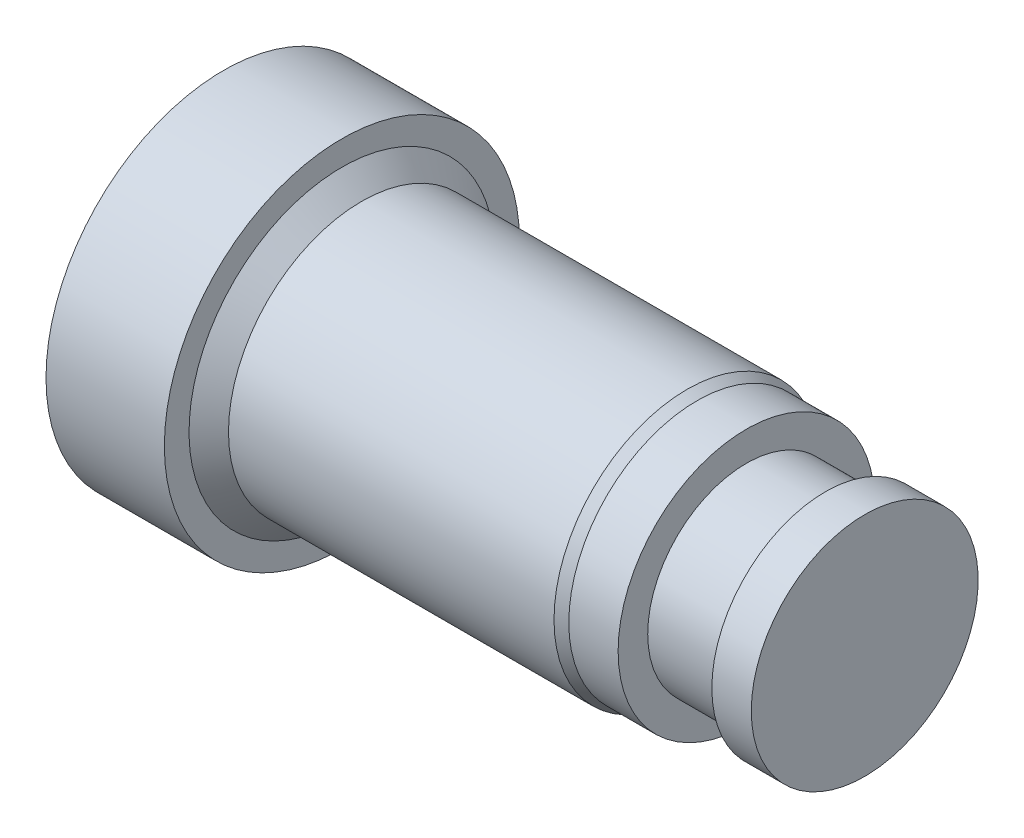
ISO-10303-21;
HEADER;
FILE_DESCRIPTION(('STEP AP214'),'2;1');
FILE_NAME('part.step','',(''),(''),'','','');
FILE_SCHEMA(('AUTOMOTIVE_DESIGN { 1 0 10303 214 1 1 1 1 }'));
ENDSEC;
DATA;
#1=APPLICATION_CONTEXT('core data for automotive mechanical design processes');
#2=APPLICATION_PROTOCOL_DEFINITION('international standard','automotive_design',2000,#1);
#3=PRODUCT_CONTEXT('',#1,'mechanical');
#4=PRODUCT('Part','Part','',(#3));
#5=PRODUCT_RELATED_PRODUCT_CATEGORY('part','',(#4));
#6=PRODUCT_DEFINITION_FORMATION('','',#4);
#7=PRODUCT_DEFINITION_CONTEXT('part definition',#1,'design');
#8=PRODUCT_DEFINITION('design','',#6,#7);
#9=PRODUCT_DEFINITION_SHAPE('','',#8);
#10=(LENGTH_UNIT() NAMED_UNIT(*) SI_UNIT(.MILLI.,.METRE.));
#11=(NAMED_UNIT(*) PLANE_ANGLE_UNIT() SI_UNIT($,.RADIAN.));
#12=(NAMED_UNIT(*) SI_UNIT($,.STERADIAN.) SOLID_ANGLE_UNIT());
#13=UNCERTAINTY_MEASURE_WITH_UNIT(LENGTH_MEASURE(1.E-05),#10,'distance_accuracy_value','');
#14=(GEOMETRIC_REPRESENTATION_CONTEXT(3) GLOBAL_UNCERTAINTY_ASSIGNED_CONTEXT((#13)) GLOBAL_UNIT_ASSIGNED_CONTEXT((#10,
#11,#12)) REPRESENTATION_CONTEXT('',''));
#15=CARTESIAN_POINT('',(0.,0.,0.));
#16=DIRECTION('',(0.,0.,1.));
#17=DIRECTION('',(1.,0.,0.));
#18=AXIS2_PLACEMENT_3D('',#15,#16,#17);
#19=CARTESIAN_POINT('',(325.,57.5,0.));
#20=DIRECTION('',(-1.,0.,0.));
#21=DIRECTION('',(0.,0.,1.));
#22=AXIS2_PLACEMENT_3D('',#19,#20,#21);
#23=PLANE('',#22);
#24=CARTESIAN_POINT('',(325.,0.,0.));
#25=DIRECTION('',(-1.,0.,0.));
#26=DIRECTION('',(0.,0.,1.));
#27=AXIS2_PLACEMENT_3D('',#24,#25,#26);
#28=CIRCLE('',#27,57.5);
#29=CARTESIAN_POINT('',(325.,0.,57.5));
#30=VERTEX_POINT('',#29);
#31=EDGE_CURVE('E20',#30,#30,#28,.T.);
#32=ORIENTED_EDGE('',*,*,#31,.F.);
#33=EDGE_LOOP('',(#32));
#34=FACE_BOUND('',#33,.T.);
#35=ADVANCED_FACE('F17',(#34),#23,.F.);
#36=CARTESIAN_POINT('',(0.,0.,0.));
#37=DIRECTION('',(-1.,0.,0.));
#38=DIRECTION('',(0.,0.,1.));
#39=AXIS2_PLACEMENT_3D('',#36,#37,#38);
#40=CYLINDRICAL_SURFACE('',#39,57.5);
#41=CARTESIAN_POINT('',(305.,0.,0.));
#42=DIRECTION('',(-1.,0.,0.));
#43=DIRECTION('',(0.,0.,1.));
#44=AXIS2_PLACEMENT_3D('',#41,#42,#43);
#45=CIRCLE('',#44,57.5);
#46=CARTESIAN_POINT('',(305.,0.,57.5));
#47=VERTEX_POINT('',#46);
#48=EDGE_CURVE('E56',#47,#47,#45,.F.);
#49=ORIENTED_EDGE('',*,*,#48,.T.);
#50=EDGE_LOOP('',(#49));
#51=FACE_BOUND('',#50,.T.);
#52=ORIENTED_EDGE('',*,*,#31,.T.);
#53=EDGE_LOOP('',(#52));
#54=FACE_BOUND('',#53,.T.);
#55=ADVANCED_FACE('F49',(#51,#54),#40,.T.);
#56=CARTESIAN_POINT('',(29.9999999999727,37.4999999999999,-64.951905283833));
#57=DIRECTION('',(-1.,0.,0.));
#58=DIRECTION('',(0.,0.,1.));
#59=AXIS2_PLACEMENT_3D('',#56,#57,#58);
#60=CONICAL_SURFACE('',#59,4.24999999998343,1.02974425867142);
#61=CARTESIAN_POINT('',(32.5536576308423,37.4999999999999,-64.951905283833));
#62=VERTEX_POINT('',#61);
#63=VERTEX_LOOP('',#62);
#64=FACE_BOUND('',#63,.T.);
#65=CARTESIAN_POINT('',(30.,37.4999999999999,-64.951905283833));
#66=DIRECTION('',(-1.,0.,0.));
#67=DIRECTION('',(0.,0.,1.));
#68=AXIS2_PLACEMENT_3D('',#65,#66,#67);
#69=CIRCLE('',#68,4.24999999999999);
#70=CARTESIAN_POINT('',(30.,37.4999999999999,-60.701905283833));
#71=VERTEX_POINT('',#70);
#72=EDGE_CURVE('E53',#71,#71,#69,.T.);
#73=ORIENTED_EDGE('',*,*,#72,.T.);
#74=EDGE_LOOP('',(#73));
#75=FACE_BOUND('',#74,.T.);
#76=ADVANCED_FACE('F45',(#64,#75),#60,.F.);
#77=CARTESIAN_POINT('',(30.0000000000296,75.,0.));
#78=DIRECTION('',(-1.,0.,0.));
#79=DIRECTION('',(0.,-1.,0.));
#80=AXIS2_PLACEMENT_3D('',#77,#78,#79);
#81=CONICAL_SURFACE('',#80,4.25000000001319,1.0297442586776);
#82=CARTESIAN_POINT('',(32.5536576308991,75.,0.));
#83=VERTEX_POINT('',#82);
#84=VERTEX_LOOP('',#83);
#85=FACE_BOUND('',#84,.T.);
#86=CARTESIAN_POINT('',(30.,75.,0.));
#87=DIRECTION('',(-1.,0.,0.));
#88=DIRECTION('',(0.,0.,1.));
#89=AXIS2_PLACEMENT_3D('',#86,#87,#88);
#90=CIRCLE('',#89,4.24999999999999);
#91=CARTESIAN_POINT('',(30.,75.,4.24999999999999));
#92=VERTEX_POINT('',#91);
#93=EDGE_CURVE('E55',#92,#92,#90,.T.);
#94=ORIENTED_EDGE('',*,*,#93,.T.);
#95=EDGE_LOOP('',(#94));
#96=FACE_BOUND('',#95,.T.);
#97=ADVANCED_FACE('F48',(#85,#96),#81,.F.);
#98=CARTESIAN_POINT('',(29.9999999999727,37.5000000000008,64.9519052838325));
#99=DIRECTION('',(-1.,0.,0.));
#100=DIRECTION('',(0.,0.,1.));
#101=AXIS2_PLACEMENT_3D('',#98,#99,#100);
#102=CONICAL_SURFACE('',#101,4.24999999998661,1.02974425868191);
#103=CARTESIAN_POINT('',(32.5536576307854,37.5000000000008,64.9519052838325));
#104=VERTEX_POINT('',#103);
#105=VERTEX_LOOP('',#104);
#106=FACE_BOUND('',#105,.T.);
#107=CARTESIAN_POINT('',(30.,37.5000000000008,64.9519052838325));
#108=DIRECTION('',(-1.,0.,0.));
#109=DIRECTION('',(0.,0.,1.));
#110=AXIS2_PLACEMENT_3D('',#107,#108,#109);
#111=CIRCLE('',#110,4.24999999999999);
#112=CARTESIAN_POINT('',(30.,37.5000000000008,69.2019052838325));
#113=VERTEX_POINT('',#112);
#114=EDGE_CURVE('E59',#113,#113,#111,.T.);
#115=ORIENTED_EDGE('',*,*,#114,.T.);
#116=EDGE_LOOP('',(#115));
#117=FACE_BOUND('',#116,.T.);
#118=ADVANCED_FACE('F123',(#106,#117),#102,.F.);
#119=CARTESIAN_POINT('',(29.9999999999727,-37.4999999999999,64.951905283833));
#120=DIRECTION('',(-1.,0.,0.));
#121=DIRECTION('',(0.,0.,1.));
#122=AXIS2_PLACEMENT_3D('',#119,#120,#121);
#123=CONICAL_SURFACE('',#122,4.2499999999861,1.0297442586818);
#124=CARTESIAN_POINT('',(32.5536576307854,-37.4999999999999,64.951905283833));
#125=VERTEX_POINT('',#124);
#126=VERTEX_LOOP('',#125);
#127=FACE_BOUND('',#126,.T.);
#128=CARTESIAN_POINT('',(30.,-37.4999999999999,64.951905283833));
#129=DIRECTION('',(-1.,0.,0.));
#130=DIRECTION('',(0.,0.,1.));
#131=AXIS2_PLACEMENT_3D('',#128,#129,#130);
#132=CIRCLE('',#131,4.24999999999999);
#133=CARTESIAN_POINT('',(30.,-37.4999999999999,69.201905283833));
#134=VERTEX_POINT('',#133);
#135=EDGE_CURVE('E115',#134,#134,#132,.T.);
#136=ORIENTED_EDGE('',*,*,#135,.T.);
#137=EDGE_LOOP('',(#136));
#138=FACE_BOUND('',#137,.T.);
#139=ADVANCED_FACE('F214',(#127,#138),#123,.F.);
#140=CARTESIAN_POINT('',(30.0000000000296,-75.,0.));
#141=DIRECTION('',(-1.,0.,0.));
#142=DIRECTION('',(0.,-1.,0.));
#143=AXIS2_PLACEMENT_3D('',#140,#141,#142);
#144=CONICAL_SURFACE('',#143,4.25000000001319,1.0297442586776);
#145=CARTESIAN_POINT('',(32.5536576308991,-75.,0.));
#146=VERTEX_POINT('',#145);
#147=VERTEX_LOOP('',#146);
#148=FACE_BOUND('',#147,.T.);
#149=CARTESIAN_POINT('',(30.,-75.,0.));
#150=DIRECTION('',(-1.,0.,0.));
#151=DIRECTION('',(0.,0.,1.));
#152=AXIS2_PLACEMENT_3D('',#149,#150,#151);
#153=CIRCLE('',#152,4.24999999999999);
#154=CARTESIAN_POINT('',(30.,-75.,4.24999999999999));
#155=VERTEX_POINT('',#154);
#156=EDGE_CURVE('E110',#155,#155,#153,.T.);
#157=ORIENTED_EDGE('',*,*,#156,.T.);
#158=EDGE_LOOP('',(#157));
#159=FACE_BOUND('',#158,.T.);
#160=ADVANCED_FACE('F216',(#148,#159),#144,.F.);
#161=CARTESIAN_POINT('',(29.9999999999727,-37.5000000000008,-64.9519052838325));
#162=DIRECTION('',(-1.,0.,0.));
#163=DIRECTION('',(0.,0.,1.));
#164=AXIS2_PLACEMENT_3D('',#161,#162,#163);
#165=CONICAL_SURFACE('',#164,4.25000000003976,1.02974425866739);
#166=CARTESIAN_POINT('',(32.5536576308991,-37.5000000000008,-64.9519052838325));
#167=VERTEX_POINT('',#166);
#168=VERTEX_LOOP('',#167);
#169=FACE_BOUND('',#168,.T.);
#170=CARTESIAN_POINT('',(30.,-37.5000000000008,-64.9519052838325));
#171=DIRECTION('',(-1.,0.,0.));
#172=DIRECTION('',(0.,0.,1.));
#173=AXIS2_PLACEMENT_3D('',#170,#171,#172);
#174=CIRCLE('',#173,4.24999999999999);
#175=CARTESIAN_POINT('',(30.,-37.5000000000008,-60.7019052838325));
#176=VERTEX_POINT('',#175);
#177=EDGE_CURVE('E106',#176,#176,#174,.T.);
#178=ORIENTED_EDGE('',*,*,#177,.T.);
#179=EDGE_LOOP('',(#178));
#180=FACE_BOUND('',#179,.T.);
#181=ADVANCED_FACE('F223',(#169,#180),#165,.F.);
#182=CARTESIAN_POINT('',(20.,0.,0.));
#183=DIRECTION('',(-1.,0.,0.));
#184=DIRECTION('',(0.,0.,1.));
#185=AXIS2_PLACEMENT_3D('',#182,#183,#184);
#186=PLANE('',#185);
#187=CARTESIAN_POINT('',(20.,0.,0.));
#188=DIRECTION('',(-1.,0.,0.));
#189=DIRECTION('',(0.,0.,1.));
#190=AXIS2_PLACEMENT_3D('',#187,#188,#189);
#191=CIRCLE('',#190,57.5);
#192=CARTESIAN_POINT('',(20.,0.,57.5));
#193=VERTEX_POINT('',#192);
#194=EDGE_CURVE('E104',#193,#193,#191,.T.);
#195=ORIENTED_EDGE('',*,*,#194,.T.);
#196=EDGE_LOOP('',(#195));
#197=FACE_BOUND('',#196,.T.);
#198=ADVANCED_FACE('F155',(#197),#186,.T.);
#199=CARTESIAN_POINT('',(305.,50.,0.));
#200=DIRECTION('',(1.,0.,0.));
#201=DIRECTION('',(0.,0.,-1.));
#202=AXIS2_PLACEMENT_3D('',#199,#200,#201);
#203=PLANE('',#202);
#204=ORIENTED_EDGE('',*,*,#48,.F.);
#205=EDGE_LOOP('',(#204));
#206=FACE_BOUND('',#205,.T.);
#207=CARTESIAN_POINT('',(305.,0.,0.));
#208=DIRECTION('',(-1.,0.,0.));
#209=DIRECTION('',(0.,0.,1.));
#210=AXIS2_PLACEMENT_3D('',#207,#208,#209);
#211=CIRCLE('',#210,50.);
#212=CARTESIAN_POINT('',(305.,0.,50.));
#213=VERTEX_POINT('',#212);
#214=EDGE_CURVE('E101',#213,#213,#211,.T.);
#215=ORIENTED_EDGE('',*,*,#214,.F.);
#216=EDGE_LOOP('',(#215));
#217=FACE_BOUND('',#216,.T.);
#218=ADVANCED_FACE('F146',(#206,#217),#203,.F.);
#219=CARTESIAN_POINT('',(0.,37.4999999999999,-64.951905283833));
#220=DIRECTION('',(-1.,0.,0.));
#221=DIRECTION('',(0.,0.,1.));
#222=AXIS2_PLACEMENT_3D('',#219,#220,#221);
#223=CYLINDRICAL_SURFACE('',#222,4.24999999999999);
#224=ORIENTED_EDGE('',*,*,#72,.F.);
#225=EDGE_LOOP('',(#224));
#226=FACE_BOUND('',#225,.T.);
#227=CARTESIAN_POINT('',(0.,37.4999999999999,-64.951905283833));
#228=DIRECTION('',(-1.,0.,0.));
#229=DIRECTION('',(0.,0.,1.));
#230=AXIS2_PLACEMENT_3D('',#227,#228,#229);
#231=CIRCLE('',#230,4.24999999999999);
#232=CARTESIAN_POINT('',(0.,37.4999999999999,-60.701905283833));
#233=VERTEX_POINT('',#232);
#234=EDGE_CURVE('E98',#233,#233,#231,.T.);
#235=ORIENTED_EDGE('',*,*,#234,.T.);
#236=EDGE_LOOP('',(#235));
#237=FACE_BOUND('',#236,.T.);
#238=ADVANCED_FACE('F144',(#226,#237),#223,.F.);
#239=CARTESIAN_POINT('',(0.,75.,0.));
#240=DIRECTION('',(-1.,0.,0.));
#241=DIRECTION('',(0.,0.,1.));
#242=AXIS2_PLACEMENT_3D('',#239,#240,#241);
#243=CYLINDRICAL_SURFACE('',#242,4.24999999999999);
#244=ORIENTED_EDGE('',*,*,#93,.F.);
#245=EDGE_LOOP('',(#244));
#246=FACE_BOUND('',#245,.T.);
#247=CARTESIAN_POINT('',(0.,75.,0.));
#248=DIRECTION('',(-1.,0.,0.));
#249=DIRECTION('',(0.,0.,1.));
#250=AXIS2_PLACEMENT_3D('',#247,#248,#249);
#251=CIRCLE('',#250,4.24999999999999);
#252=CARTESIAN_POINT('',(0.,75.,4.24999999999999));
#253=VERTEX_POINT('',#252);
#254=EDGE_CURVE('E95',#253,#253,#251,.T.);
#255=ORIENTED_EDGE('',*,*,#254,.T.);
#256=EDGE_LOOP('',(#255));
#257=FACE_BOUND('',#256,.T.);
#258=ADVANCED_FACE('F129',(#246,#257),#243,.F.);
#259=CARTESIAN_POINT('',(0.,37.5000000000008,64.9519052838325));
#260=DIRECTION('',(-1.,0.,0.));
#261=DIRECTION('',(0.,0.,1.));
#262=AXIS2_PLACEMENT_3D('',#259,#260,#261);
#263=CYLINDRICAL_SURFACE('',#262,4.24999999999999);
#264=ORIENTED_EDGE('',*,*,#114,.F.);
#265=EDGE_LOOP('',(#264));
#266=FACE_BOUND('',#265,.T.);
#267=CARTESIAN_POINT('',(0.,37.5000000000008,64.9519052838325));
#268=DIRECTION('',(-1.,0.,0.));
#269=DIRECTION('',(0.,0.,1.));
#270=AXIS2_PLACEMENT_3D('',#267,#268,#269);
#271=CIRCLE('',#270,4.24999999999999);
#272=CARTESIAN_POINT('',(0.,37.5000000000008,69.2019052838325));
#273=VERTEX_POINT('',#272);
#274=EDGE_CURVE('E92',#273,#273,#271,.T.);
#275=ORIENTED_EDGE('',*,*,#274,.T.);
#276=EDGE_LOOP('',(#275));
#277=FACE_BOUND('',#276,.T.);
#278=ADVANCED_FACE('F125',(#266,#277),#263,.F.);
#279=CARTESIAN_POINT('',(0.,-37.4999999999999,64.951905283833));
#280=DIRECTION('',(-1.,0.,0.));
#281=DIRECTION('',(0.,0.,1.));
#282=AXIS2_PLACEMENT_3D('',#279,#280,#281);
#283=CYLINDRICAL_SURFACE('',#282,4.24999999999999);
#284=ORIENTED_EDGE('',*,*,#135,.F.);
#285=EDGE_LOOP('',(#284));
#286=FACE_BOUND('',#285,.T.);
#287=CARTESIAN_POINT('',(0.,-37.4999999999999,64.951905283833));
#288=DIRECTION('',(-1.,0.,0.));
#289=DIRECTION('',(0.,0.,1.));
#290=AXIS2_PLACEMENT_3D('',#287,#288,#289);
#291=CIRCLE('',#290,4.24999999999999);
#292=CARTESIAN_POINT('',(0.,-37.4999999999999,69.201905283833));
#293=VERTEX_POINT('',#292);
#294=EDGE_CURVE('E89',#293,#293,#291,.T.);
#295=ORIENTED_EDGE('',*,*,#294,.T.);
#296=EDGE_LOOP('',(#295));
#297=FACE_BOUND('',#296,.T.);
#298=ADVANCED_FACE('F128',(#286,#297),#283,.F.);
#299=CARTESIAN_POINT('',(0.,-75.,0.));
#300=DIRECTION('',(-1.,0.,0.));
#301=DIRECTION('',(0.,0.,1.));
#302=AXIS2_PLACEMENT_3D('',#299,#300,#301);
#303=CYLINDRICAL_SURFACE('',#302,4.24999999999999);
#304=ORIENTED_EDGE('',*,*,#156,.F.);
#305=EDGE_LOOP('',(#304));
#306=FACE_BOUND('',#305,.T.);
#307=CARTESIAN_POINT('',(0.,-75.,0.));
#308=DIRECTION('',(-1.,0.,0.));
#309=DIRECTION('',(0.,0.,1.));
#310=AXIS2_PLACEMENT_3D('',#307,#308,#309);
#311=CIRCLE('',#310,4.24999999999999);
#312=CARTESIAN_POINT('',(0.,-75.,4.24999999999999));
#313=VERTEX_POINT('',#312);
#314=EDGE_CURVE('E86',#313,#313,#311,.T.);
#315=ORIENTED_EDGE('',*,*,#314,.T.);
#316=EDGE_LOOP('',(#315));
#317=FACE_BOUND('',#316,.T.);
#318=ADVANCED_FACE('F200',(#306,#317),#303,.F.);
#319=CARTESIAN_POINT('',(0.,-37.5000000000008,-64.9519052838325));
#320=DIRECTION('',(-1.,0.,0.));
#321=DIRECTION('',(0.,0.,1.));
#322=AXIS2_PLACEMENT_3D('',#319,#320,#321);
#323=CYLINDRICAL_SURFACE('',#322,4.24999999999999);
#324=ORIENTED_EDGE('',*,*,#177,.F.);
#325=EDGE_LOOP('',(#324));
#326=FACE_BOUND('',#325,.T.);
#327=CARTESIAN_POINT('',(0.,-37.5000000000008,-64.9519052838325));
#328=DIRECTION('',(-1.,0.,0.));
#329=DIRECTION('',(0.,0.,1.));
#330=AXIS2_PLACEMENT_3D('',#327,#328,#329);
#331=CIRCLE('',#330,4.24999999999999);
#332=CARTESIAN_POINT('',(0.,-37.5000000000008,-60.7019052838325));
#333=VERTEX_POINT('',#332);
#334=EDGE_CURVE('E83',#333,#333,#331,.T.);
#335=ORIENTED_EDGE('',*,*,#334,.T.);
#336=EDGE_LOOP('',(#335));
#337=FACE_BOUND('',#336,.T.);
#338=ADVANCED_FACE('F196',(#326,#337),#323,.F.);
#339=CARTESIAN_POINT('',(20.,0.,0.));
#340=DIRECTION('',(-1.,0.,0.));
#341=DIRECTION('',(0.,0.,1.));
#342=AXIS2_PLACEMENT_3D('',#339,#340,#341);
#343=CYLINDRICAL_SURFACE('',#342,57.5);
#344=ORIENTED_EDGE('',*,*,#194,.F.);
#345=EDGE_LOOP('',(#344));
#346=FACE_BOUND('',#345,.T.);
#347=CARTESIAN_POINT('',(0.,0.,0.));
#348=DIRECTION('',(-1.,0.,0.));
#349=DIRECTION('',(0.,0.,1.));
#350=AXIS2_PLACEMENT_3D('',#347,#348,#349);
#351=CIRCLE('',#350,57.5);
#352=CARTESIAN_POINT('',(0.,0.,57.5));
#353=VERTEX_POINT('',#352);
#354=EDGE_CURVE('E80',#353,#353,#351,.T.);
#355=ORIENTED_EDGE('',*,*,#354,.T.);
#356=EDGE_LOOP('',(#355));
#357=FACE_BOUND('',#356,.T.);
#358=ADVANCED_FACE('F192',(#346,#357),#343,.F.);
#359=CARTESIAN_POINT('',(0.,0.,0.));
#360=DIRECTION('',(-1.,0.,0.));
#361=DIRECTION('',(0.,0.,1.));
#362=AXIS2_PLACEMENT_3D('',#359,#360,#361);
#363=CYLINDRICAL_SURFACE('',#362,50.);
#364=CARTESIAN_POINT('',(265.,0.,0.));
#365=DIRECTION('',(-1.,0.,0.));
#366=DIRECTION('',(0.,0.,1.));
#367=AXIS2_PLACEMENT_3D('',#364,#365,#366);
#368=CIRCLE('',#367,50.);
#369=CARTESIAN_POINT('',(265.,0.,50.));
#370=VERTEX_POINT('',#369);
#371=EDGE_CURVE('E77',#370,#370,#368,.F.);
#372=ORIENTED_EDGE('',*,*,#371,.T.);
#373=EDGE_LOOP('',(#372));
#374=FACE_BOUND('',#373,.T.);
#375=ORIENTED_EDGE('',*,*,#214,.T.);
#376=EDGE_LOOP('',(#375));
#377=FACE_BOUND('',#376,.T.);
#378=ADVANCED_FACE('F137',(#374,#377),#363,.T.);
#379=CARTESIAN_POINT('',(0.,0.,0.));
#380=DIRECTION('',(1.,0.,0.));
#381=DIRECTION('',(0.,0.,-1.));
#382=AXIS2_PLACEMENT_3D('',#379,#380,#381);
#383=PLANE('',#382);
#384=CARTESIAN_POINT('',(0.,0.,0.));
#385=DIRECTION('',(-1.,0.,0.));
#386=DIRECTION('',(0.,0.,1.));
#387=AXIS2_PLACEMENT_3D('',#384,#385,#386);
#388=CIRCLE('',#387,90.);
#389=CARTESIAN_POINT('',(0.,0.,90.));
#390=VERTEX_POINT('',#389);
#391=EDGE_CURVE('E74',#390,#390,#388,.F.);
#392=ORIENTED_EDGE('',*,*,#391,.F.);
#393=EDGE_LOOP('',(#392));
#394=FACE_BOUND('',#393,.T.);
#395=ORIENTED_EDGE('',*,*,#354,.F.);
#396=EDGE_LOOP('',(#395));
#397=FACE_BOUND('',#396,.T.);
#398=ORIENTED_EDGE('',*,*,#334,.F.);
#399=EDGE_LOOP('',(#398));
#400=FACE_BOUND('',#399,.T.);
#401=ORIENTED_EDGE('',*,*,#314,.F.);
#402=EDGE_LOOP('',(#401));
#403=FACE_BOUND('',#402,.T.);
#404=ORIENTED_EDGE('',*,*,#294,.F.);
#405=EDGE_LOOP('',(#404));
#406=FACE_BOUND('',#405,.T.);
#407=ORIENTED_EDGE('',*,*,#274,.F.);
#408=EDGE_LOOP('',(#407));
#409=FACE_BOUND('',#408,.T.);
#410=ORIENTED_EDGE('',*,*,#254,.F.);
#411=EDGE_LOOP('',(#410));
#412=FACE_BOUND('',#411,.T.);
#413=ORIENTED_EDGE('',*,*,#234,.F.);
#414=EDGE_LOOP('',(#413));
#415=FACE_BOUND('',#414,.T.);
#416=ADVANCED_FACE('F133',(#394,#397,#400,#403,#406,#409,#412,#415),#383,.F.);
#417=CARTESIAN_POINT('',(265.,65.,0.));
#418=DIRECTION('',(-1.,0.,0.));
#419=DIRECTION('',(0.,0.,1.));
#420=AXIS2_PLACEMENT_3D('',#417,#418,#419);
#421=PLANE('',#420);
#422=ORIENTED_EDGE('',*,*,#371,.F.);
#423=EDGE_LOOP('',(#422));
#424=FACE_BOUND('',#423,.T.);
#425=CARTESIAN_POINT('',(265.,0.,0.));
#426=DIRECTION('',(-1.,0.,0.));
#427=DIRECTION('',(0.,0.,1.));
#428=AXIS2_PLACEMENT_3D('',#425,#426,#427);
#429=CIRCLE('',#428,65.);
#430=CARTESIAN_POINT('',(265.,0.,65.));
#431=VERTEX_POINT('',#430);
#432=EDGE_CURVE('E71',#431,#431,#429,.T.);
#433=ORIENTED_EDGE('',*,*,#432,.F.);
#434=EDGE_LOOP('',(#433));
#435=FACE_BOUND('',#434,.T.);
#436=ADVANCED_FACE('F136',(#424,#435),#421,.F.);
#437=CARTESIAN_POINT('',(0.,0.,0.));
#438=DIRECTION('',(-1.,0.,0.));
#439=DIRECTION('',(0.,0.,1.));
#440=AXIS2_PLACEMENT_3D('',#437,#438,#439);
#441=CYLINDRICAL_SURFACE('',#440,90.);
#442=ORIENTED_EDGE('',*,*,#391,.T.);
#443=EDGE_LOOP('',(#442));
#444=FACE_BOUND('',#443,.T.);
#445=CARTESIAN_POINT('',(60.,0.,0.));
#446=DIRECTION('',(-1.,0.,0.));
#447=DIRECTION('',(0.,0.,1.));
#448=AXIS2_PLACEMENT_3D('',#445,#446,#447);
#449=CIRCLE('',#448,90.);
#450=CARTESIAN_POINT('',(60.,0.,90.));
#451=VERTEX_POINT('',#450);
#452=EDGE_CURVE('E68',#451,#451,#449,.T.);
#453=ORIENTED_EDGE('',*,*,#452,.T.);
#454=EDGE_LOOP('',(#453));
#455=FACE_BOUND('',#454,.T.);
#456=ADVANCED_FACE('F182',(#444,#455),#441,.T.);
#457=CARTESIAN_POINT('',(0.,0.,0.));
#458=DIRECTION('',(-1.,0.,0.));
#459=DIRECTION('',(0.,0.,1.));
#460=AXIS2_PLACEMENT_3D('',#457,#458,#459);
#461=CYLINDRICAL_SURFACE('',#460,65.);
#462=ORIENTED_EDGE('',*,*,#432,.T.);
#463=EDGE_LOOP('',(#462));
#464=FACE_BOUND('',#463,.T.);
#465=CARTESIAN_POINT('',(240.,0.,0.));
#466=DIRECTION('',(-1.,0.,0.));
#467=DIRECTION('',(0.,0.,1.));
#468=AXIS2_PLACEMENT_3D('',#465,#466,#467);
#469=CIRCLE('',#468,65.);
#470=CARTESIAN_POINT('',(240.,0.,65.));
#471=VERTEX_POINT('',#470);
#472=EDGE_CURVE('E67',#471,#471,#469,.T.);
#473=ORIENTED_EDGE('',*,*,#472,.F.);
#474=EDGE_LOOP('',(#473));
#475=FACE_BOUND('',#474,.T.);
#476=ADVANCED_FACE('F178',(#464,#475),#461,.T.);
#477=CARTESIAN_POINT('',(60.,90.,0.));
#478=DIRECTION('',(-1.,0.,0.));
#479=DIRECTION('',(0.,0.,1.));
#480=AXIS2_PLACEMENT_3D('',#477,#478,#479);
#481=PLANE('',#480);
#482=CARTESIAN_POINT('',(60.,0.,0.));
#483=DIRECTION('',(-1.,0.,0.));
#484=DIRECTION('',(0.,-1.,0.));
#485=AXIS2_PLACEMENT_3D('',#482,#483,#484);
#486=CIRCLE('',#485,77.5);
#487=CARTESIAN_POINT('',(60.,-77.5,0.));
#488=VERTEX_POINT('',#487);
#489=EDGE_CURVE('E64',#488,#488,#486,.F.);
#490=ORIENTED_EDGE('',*,*,#489,.F.);
#491=EDGE_LOOP('',(#490));
#492=FACE_BOUND('',#491,.T.);
#493=ORIENTED_EDGE('',*,*,#452,.F.);
#494=EDGE_LOOP('',(#493));
#495=FACE_BOUND('',#494,.T.);
#496=ADVANCED_FACE('F174',(#492,#495),#481,.F.);
#497=CARTESIAN_POINT('',(235.,0.,0.));
#498=DIRECTION('',(-1.,0.,0.));
#499=DIRECTION('',(0.,0.,1.));
#500=AXIS2_PLACEMENT_3D('',#497,#498,#499);
#501=CONICAL_SURFACE('',#500,67.5,0.463647609000804);
#502=ORIENTED_EDGE('',*,*,#472,.T.);
#503=EDGE_LOOP('',(#502));
#504=FACE_BOUND('',#503,.T.);
#505=CARTESIAN_POINT('',(235.,0.,0.));
#506=DIRECTION('',(-1.,0.,0.));
#507=DIRECTION('',(0.,0.,1.));
#508=AXIS2_PLACEMENT_3D('',#505,#506,#507);
#509=CIRCLE('',#508,67.5);
#510=CARTESIAN_POINT('',(235.,0.,67.5));
#511=VERTEX_POINT('',#510);
#512=EDGE_CURVE('E26',#511,#511,#509,.T.);
#513=ORIENTED_EDGE('',*,*,#512,.F.);
#514=EDGE_LOOP('',(#513));
#515=FACE_BOUND('',#514,.T.);
#516=ADVANCED_FACE('F166',(#504,#515),#501,.T.);
#517=CARTESIAN_POINT('',(60.,0.,0.));
#518=DIRECTION('',(-1.,0.,0.));
#519=DIRECTION('',(0.,-1.,0.));
#520=AXIS2_PLACEMENT_3D('',#517,#518,#519);
#521=CONICAL_SURFACE('',#520,77.5,0.785398163397448);
#522=CARTESIAN_POINT('',(70.,0.,0.));
#523=DIRECTION('',(-1.,0.,0.));
#524=DIRECTION('',(0.,0.,1.));
#525=AXIS2_PLACEMENT_3D('',#522,#523,#524);
#526=CIRCLE('',#525,67.5);
#527=CARTESIAN_POINT('',(70.,0.,67.5));
#528=VERTEX_POINT('',#527);
#529=EDGE_CURVE('E11',#528,#528,#526,.F.);
#530=ORIENTED_EDGE('',*,*,#529,.F.);
#531=EDGE_LOOP('',(#530));
#532=FACE_BOUND('',#531,.T.);
#533=ORIENTED_EDGE('',*,*,#489,.T.);
#534=EDGE_LOOP('',(#533));
#535=FACE_BOUND('',#534,.T.);
#536=ADVANCED_FACE('F160',(#532,#535),#521,.T.);
#537=CARTESIAN_POINT('',(0.,0.,0.));
#538=DIRECTION('',(-1.,0.,0.));
#539=DIRECTION('',(0.,0.,1.));
#540=AXIS2_PLACEMENT_3D('',#537,#538,#539);
#541=CYLINDRICAL_SURFACE('',#540,67.5);
#542=ORIENTED_EDGE('',*,*,#512,.T.);
#543=EDGE_LOOP('',(#542));
#544=FACE_BOUND('',#543,.T.);
#545=ORIENTED_EDGE('',*,*,#529,.T.);
#546=EDGE_LOOP('',(#545));
#547=FACE_BOUND('',#546,.T.);
#548=ADVANCED_FACE('F158',(#544,#547),#541,.T.);
#549=CLOSED_SHELL('',(#35,#55,#76,#97,#118,#139,#160,#181,#198,#218,#238,#258,#278,#298,#318,
#338,#358,#378,#416,#436,#456,#476,#496,#516,#536,#548));
#550=MANIFOLD_SOLID_BREP('B1',#549);
#551=ADVANCED_BREP_SHAPE_REPRESENTATION('',(#18,#550),#14);
#552=SHAPE_DEFINITION_REPRESENTATION(#9,#551);
ENDSEC;
END-ISO-10303-21;
